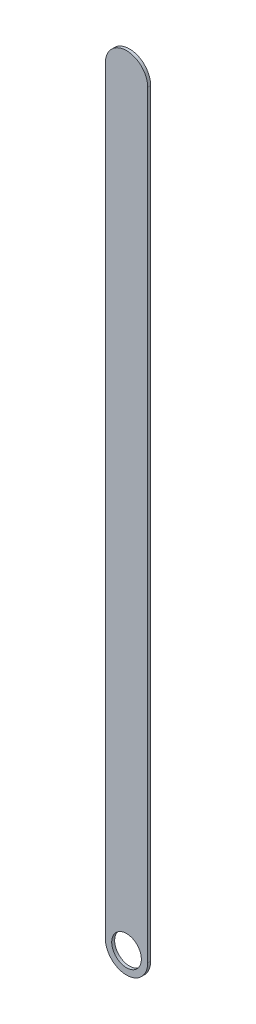
ISO-10303-21;
HEADER;
FILE_DESCRIPTION(('STEP AP214'),'2;1');
FILE_NAME('part.step','',(''),(''),'','','');
FILE_SCHEMA(('AUTOMOTIVE_DESIGN { 1 0 10303 214 1 1 1 1 }'));
ENDSEC;
DATA;
#1=APPLICATION_CONTEXT('core data for automotive mechanical design processes');
#2=APPLICATION_PROTOCOL_DEFINITION('international standard','automotive_design',2000,#1);
#3=PRODUCT_CONTEXT('',#1,'mechanical');
#4=PRODUCT('Part','Part','',(#3));
#5=PRODUCT_RELATED_PRODUCT_CATEGORY('part','',(#4));
#6=PRODUCT_DEFINITION_FORMATION('','',#4);
#7=PRODUCT_DEFINITION_CONTEXT('part definition',#1,'design');
#8=PRODUCT_DEFINITION('design','',#6,#7);
#9=PRODUCT_DEFINITION_SHAPE('','',#8);
#10=(LENGTH_UNIT() NAMED_UNIT(*) SI_UNIT(.MILLI.,.METRE.));
#11=(NAMED_UNIT(*) PLANE_ANGLE_UNIT() SI_UNIT($,.RADIAN.));
#12=(NAMED_UNIT(*) SI_UNIT($,.STERADIAN.) SOLID_ANGLE_UNIT());
#13=UNCERTAINTY_MEASURE_WITH_UNIT(LENGTH_MEASURE(1.E-05),#10,'distance_accuracy_value','');
#14=(GEOMETRIC_REPRESENTATION_CONTEXT(3) GLOBAL_UNCERTAINTY_ASSIGNED_CONTEXT((#13)) GLOBAL_UNIT_ASSIGNED_CONTEXT((#10,
#11,#12)) REPRESENTATION_CONTEXT('',''));
#15=CARTESIAN_POINT('',(0.,0.,0.));
#16=DIRECTION('',(0.,0.,1.));
#17=DIRECTION('',(1.,0.,0.));
#18=AXIS2_PLACEMENT_3D('',#15,#16,#17);
#19=CARTESIAN_POINT('',(107.76,-108.63,-0.045));
#20=DIRECTION('',(0.,0.,-1.));
#21=DIRECTION('',(0.,-1.,0.));
#22=AXIS2_PLACEMENT_3D('',#19,#20,#21);
#23=CYLINDRICAL_SURFACE('',#22,0.175);
#24=CARTESIAN_POINT('',(107.76,-108.63,1.6));
#25=DIRECTION('',(0.,0.,-1.));
#26=DIRECTION('',(0.,-1.,0.));
#27=AXIS2_PLACEMENT_3D('',#24,#25,#26);
#28=CIRCLE('',#27,0.175);
#29=CARTESIAN_POINT('',(107.76,-108.805,1.6));
#30=VERTEX_POINT('',#29);
#31=EDGE_CURVE('E115',#30,#30,#28,.T.);
#32=ORIENTED_EDGE('',*,*,#31,.T.);
#33=DIRECTION('',(0.,0.,1.));
#34=VECTOR('',#33,1.);
#35=CARTESIAN_POINT('',(107.76,-108.805,-0.045));
#36=LINE('',#35,#34);
#37=CARTESIAN_POINT('',(107.76,-108.805,1.635));
#38=VERTEX_POINT('',#37);
#39=EDGE_CURVE('E11',#30,#38,#36,.T.);
#40=ORIENTED_EDGE('',*,*,#39,.T.);
#41=CARTESIAN_POINT('',(107.76,-108.63,1.635));
#42=DIRECTION('',(0.,0.,-1.));
#43=DIRECTION('',(0.,-1.,0.));
#44=AXIS2_PLACEMENT_3D('',#41,#42,#43);
#45=CIRCLE('',#44,0.175);
#46=EDGE_CURVE('E20',#38,#38,#45,.T.);
#47=ORIENTED_EDGE('',*,*,#46,.F.);
#48=ORIENTED_EDGE('',*,*,#39,.F.);
#49=EDGE_LOOP('',(#32,#40,#47,#48));
#50=FACE_BOUND('',#49,.T.);
#51=ADVANCED_FACE('F17',(#50),#23,.F.);
#52=CARTESIAN_POINT('',(107.51,-99.68,1.6));
#53=DIRECTION('',(1.,0.,0.));
#54=DIRECTION('',(0.,1.,0.));
#55=AXIS2_PLACEMENT_3D('',#52,#53,#54);
#56=PLANE('',#55);
#57=DIRECTION('',(0.,-1.,0.));
#58=VECTOR('',#57,1.);
#59=CARTESIAN_POINT('',(107.51,-99.68,1.6));
#60=LINE('',#59,#58);
#61=CARTESIAN_POINT('',(107.51,-99.68,1.6));
#62=VERTEX_POINT('',#61);
#63=CARTESIAN_POINT('',(107.51,-108.63,1.6));
#64=VERTEX_POINT('',#63);
#65=EDGE_CURVE('E113',#62,#64,#60,.T.);
#66=ORIENTED_EDGE('',*,*,#65,.T.);
#67=DIRECTION('',(0.,0.,1.));
#68=VECTOR('',#67,1.);
#69=CARTESIAN_POINT('',(107.51,-108.63,1.6));
#70=LINE('',#69,#68);
#71=CARTESIAN_POINT('',(107.51,-108.63,1.635));
#72=VERTEX_POINT('',#71);
#73=EDGE_CURVE('E83',#64,#72,#70,.T.);
#74=ORIENTED_EDGE('',*,*,#73,.T.);
#75=DIRECTION('',(0.,-1.,0.));
#76=VECTOR('',#75,1.);
#77=CARTESIAN_POINT('',(107.51,-99.68,1.635));
#78=LINE('',#77,#76);
#79=CARTESIAN_POINT('',(107.51,-99.68,1.635));
#80=VERTEX_POINT('',#79);
#81=EDGE_CURVE('E118',#80,#72,#78,.T.);
#82=ORIENTED_EDGE('',*,*,#81,.F.);
#83=DIRECTION('',(0.,0.,1.));
#84=VECTOR('',#83,1.);
#85=CARTESIAN_POINT('',(107.51,-99.68,1.6));
#86=LINE('',#85,#84);
#87=EDGE_CURVE('E125',#62,#80,#86,.T.);
#88=ORIENTED_EDGE('',*,*,#87,.F.);
#89=EDGE_LOOP('',(#66,#74,#82,#88));
#90=FACE_BOUND('',#89,.T.);
#91=ADVANCED_FACE('F141',(#90),#56,.F.);
#92=CARTESIAN_POINT('',(108.01,-108.63,1.635));
#93=DIRECTION('',(0.,0.,1.));
#94=DIRECTION('',(1.,0.,0.));
#95=AXIS2_PLACEMENT_3D('',#92,#93,#94);
#96=PLANE('',#95);
#97=ORIENTED_EDGE('',*,*,#46,.T.);
#98=EDGE_LOOP('',(#97));
#99=FACE_BOUND('',#98,.T.);
#100=DIRECTION('',(0.,1.,0.));
#101=VECTOR('',#100,1.);
#102=CARTESIAN_POINT('',(108.01,-108.63,1.635));
#103=LINE('',#102,#101);
#104=CARTESIAN_POINT('',(108.01,-108.63,1.635));
#105=VERTEX_POINT('',#104);
#106=CARTESIAN_POINT('',(108.01,-99.68,1.635));
#107=VERTEX_POINT('',#106);
#108=EDGE_CURVE('E95',#105,#107,#103,.T.);
#109=ORIENTED_EDGE('',*,*,#108,.T.);
#110=CARTESIAN_POINT('',(107.76,-99.68,1.635));
#111=DIRECTION('',(0.,0.,1.));
#112=DIRECTION('',(1.,0.,0.));
#113=AXIS2_PLACEMENT_3D('',#110,#111,#112);
#114=CIRCLE('',#113,0.25);
#115=EDGE_CURVE('E116',#107,#80,#114,.T.);
#116=ORIENTED_EDGE('',*,*,#115,.T.);
#117=ORIENTED_EDGE('',*,*,#81,.T.);
#118=CARTESIAN_POINT('',(107.76,-108.63,1.635));
#119=DIRECTION('',(0.,0.,1.));
#120=DIRECTION('',(-1.,0.,0.));
#121=AXIS2_PLACEMENT_3D('',#118,#119,#120);
#122=CIRCLE('',#121,0.25);
#123=EDGE_CURVE('E87',#72,#105,#122,.T.);
#124=ORIENTED_EDGE('',*,*,#123,.T.);
#125=EDGE_LOOP('',(#109,#116,#117,#124));
#126=FACE_BOUND('',#125,.T.);
#127=ADVANCED_FACE('F136',(#99,#126),#96,.T.);
#128=CARTESIAN_POINT('',(108.01,-108.63,1.6));
#129=DIRECTION('',(0.,0.,1.));
#130=DIRECTION('',(1.,0.,0.));
#131=AXIS2_PLACEMENT_3D('',#128,#129,#130);
#132=PLANE('',#131);
#133=ORIENTED_EDGE('',*,*,#31,.F.);
#134=EDGE_LOOP('',(#133));
#135=FACE_BOUND('',#134,.T.);
#136=CARTESIAN_POINT('',(107.76,-108.63,1.6));
#137=DIRECTION('',(0.,0.,1.));
#138=DIRECTION('',(-1.,0.,0.));
#139=AXIS2_PLACEMENT_3D('',#136,#137,#138);
#140=CIRCLE('',#139,0.25);
#141=CARTESIAN_POINT('',(108.01,-108.63,1.6));
#142=VERTEX_POINT('',#141);
#143=EDGE_CURVE('E76',#64,#142,#140,.T.);
#144=ORIENTED_EDGE('',*,*,#143,.F.);
#145=ORIENTED_EDGE('',*,*,#65,.F.);
#146=CARTESIAN_POINT('',(107.76,-99.68,1.6));
#147=DIRECTION('',(0.,0.,1.));
#148=DIRECTION('',(1.,0.,0.));
#149=AXIS2_PLACEMENT_3D('',#146,#147,#148);
#150=CIRCLE('',#149,0.25);
#151=CARTESIAN_POINT('',(108.01,-99.68,1.6));
#152=VERTEX_POINT('',#151);
#153=EDGE_CURVE('E100',#152,#62,#150,.T.);
#154=ORIENTED_EDGE('',*,*,#153,.F.);
#155=DIRECTION('',(0.,1.,0.));
#156=VECTOR('',#155,1.);
#157=CARTESIAN_POINT('',(108.01,-108.63,1.6));
#158=LINE('',#157,#156);
#159=EDGE_CURVE('E93',#142,#152,#158,.T.);
#160=ORIENTED_EDGE('',*,*,#159,.F.);
#161=EDGE_LOOP('',(#144,#145,#154,#160));
#162=FACE_BOUND('',#161,.T.);
#163=ADVANCED_FACE('F98',(#135,#162),#132,.F.);
#164=CARTESIAN_POINT('',(107.76,-99.68,1.6));
#165=DIRECTION('',(0.,0.,-1.));
#166=DIRECTION('',(1.,0.,0.));
#167=AXIS2_PLACEMENT_3D('',#164,#165,#166);
#168=CYLINDRICAL_SURFACE('',#167,0.25);
#169=ORIENTED_EDGE('',*,*,#153,.T.);
#170=ORIENTED_EDGE('',*,*,#87,.T.);
#171=ORIENTED_EDGE('',*,*,#115,.F.);
#172=DIRECTION('',(0.,0.,1.));
#173=VECTOR('',#172,1.);
#174=CARTESIAN_POINT('',(108.01,-99.68,1.6));
#175=LINE('',#174,#173);
#176=EDGE_CURVE('E103',#152,#107,#175,.T.);
#177=ORIENTED_EDGE('',*,*,#176,.F.);
#178=EDGE_LOOP('',(#169,#170,#171,#177));
#179=FACE_BOUND('',#178,.T.);
#180=ADVANCED_FACE('F139',(#179),#168,.T.);
#181=CARTESIAN_POINT('',(107.76,-108.63,1.6));
#182=DIRECTION('',(0.,0.,-1.));
#183=DIRECTION('',(-1.,0.,0.));
#184=AXIS2_PLACEMENT_3D('',#181,#182,#183);
#185=CYLINDRICAL_SURFACE('',#184,0.25);
#186=ORIENTED_EDGE('',*,*,#143,.T.);
#187=DIRECTION('',(0.,0.,1.));
#188=VECTOR('',#187,1.);
#189=CARTESIAN_POINT('',(108.01,-108.63,1.6));
#190=LINE('',#189,#188);
#191=EDGE_CURVE('E80',#142,#105,#190,.T.);
#192=ORIENTED_EDGE('',*,*,#191,.T.);
#193=ORIENTED_EDGE('',*,*,#123,.F.);
#194=ORIENTED_EDGE('',*,*,#73,.F.);
#195=EDGE_LOOP('',(#186,#192,#193,#194));
#196=FACE_BOUND('',#195,.T.);
#197=ADVANCED_FACE('F78',(#196),#185,.T.);
#198=CARTESIAN_POINT('',(108.01,-108.63,1.6));
#199=DIRECTION('',(-1.,0.,0.));
#200=DIRECTION('',(0.,0.,1.));
#201=AXIS2_PLACEMENT_3D('',#198,#199,#200);
#202=PLANE('',#201);
#203=ORIENTED_EDGE('',*,*,#159,.T.);
#204=ORIENTED_EDGE('',*,*,#176,.T.);
#205=ORIENTED_EDGE('',*,*,#108,.F.);
#206=ORIENTED_EDGE('',*,*,#191,.F.);
#207=EDGE_LOOP('',(#203,#204,#205,#206));
#208=FACE_BOUND('',#207,.T.);
#209=ADVANCED_FACE('F91',(#208),#202,.F.);
#210=CLOSED_SHELL('',(#51,#91,#127,#163,#180,#197,#209));
#211=MANIFOLD_SOLID_BREP('B1',#210);
#212=ADVANCED_BREP_SHAPE_REPRESENTATION('',(#18,#211),#14);
#213=SHAPE_DEFINITION_REPRESENTATION(#9,#212);
ENDSEC;
END-ISO-10303-21;
